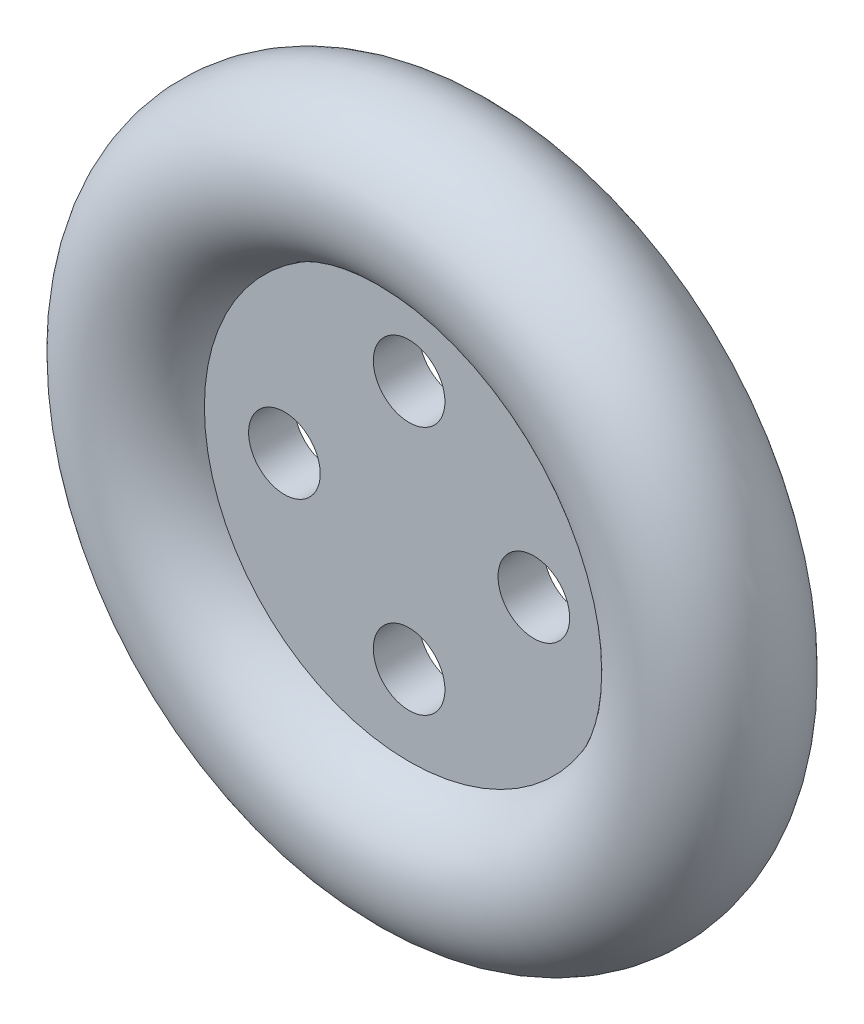
ISO-10303-21;
HEADER;
FILE_DESCRIPTION(('STEP AP214'),'2;1');
FILE_NAME('part.step','',(''),(''),'','','');
FILE_SCHEMA(('AUTOMOTIVE_DESIGN { 1 0 10303 214 1 1 1 1 }'));
ENDSEC;
DATA;
#1=APPLICATION_CONTEXT('core data for automotive mechanical design processes');
#2=APPLICATION_PROTOCOL_DEFINITION('international standard','automotive_design',2000,#1);
#3=PRODUCT_CONTEXT('',#1,'mechanical');
#4=PRODUCT('Part','Part','',(#3));
#5=PRODUCT_RELATED_PRODUCT_CATEGORY('part','',(#4));
#6=PRODUCT_DEFINITION_FORMATION('','',#4);
#7=PRODUCT_DEFINITION_CONTEXT('part definition',#1,'design');
#8=PRODUCT_DEFINITION('design','',#6,#7);
#9=PRODUCT_DEFINITION_SHAPE('','',#8);
#10=(LENGTH_UNIT() NAMED_UNIT(*) SI_UNIT(.MILLI.,.METRE.));
#11=(NAMED_UNIT(*) PLANE_ANGLE_UNIT() SI_UNIT($,.RADIAN.));
#12=(NAMED_UNIT(*) SI_UNIT($,.STERADIAN.) SOLID_ANGLE_UNIT());
#13=UNCERTAINTY_MEASURE_WITH_UNIT(LENGTH_MEASURE(1.E-05),#10,'distance_accuracy_value','');
#14=(GEOMETRIC_REPRESENTATION_CONTEXT(3) GLOBAL_UNCERTAINTY_ASSIGNED_CONTEXT((#13)) GLOBAL_UNIT_ASSIGNED_CONTEXT((#10,
#11,#12)) REPRESENTATION_CONTEXT('',''));
#15=CARTESIAN_POINT('',(0.,0.,0.));
#16=DIRECTION('',(0.,0.,1.));
#17=DIRECTION('',(1.,0.,0.));
#18=AXIS2_PLACEMENT_3D('',#15,#16,#17);
#19=CARTESIAN_POINT('',(0.,0.,5.));
#20=DIRECTION('',(0.,0.,-1.));
#21=DIRECTION('',(-1.,0.,0.));
#22=AXIS2_PLACEMENT_3D('',#19,#20,#21);
#23=TOROIDAL_SURFACE('',#22,60.5025004861397,16.6313248127819);
#24=CARTESIAN_POINT('',(0.,0.,10.));
#25=DIRECTION('',(0.,0.,-1.));
#26=DIRECTION('',(-1.,0.,0.));
#27=AXIS2_PLACEMENT_3D('',#24,#25,#26);
#28=CIRCLE('',#27,44.640566019365);
#29=CARTESIAN_POINT('',(-44.640566019365,0.,10.));
#30=VERTEX_POINT('',#29);
#31=EDGE_CURVE('E10',#30,#30,#28,.T.);
#32=ORIENTED_EDGE('',*,*,#31,.T.);
#33=EDGE_LOOP('',(#32));
#34=FACE_BOUND('',#33,.T.);
#35=CARTESIAN_POINT('',(0.,0.,0.));
#36=DIRECTION('',(0.,0.,-1.));
#37=DIRECTION('',(-1.,0.,0.));
#38=AXIS2_PLACEMENT_3D('',#35,#36,#37);
#39=CIRCLE('',#38,44.640566019365);
#40=CARTESIAN_POINT('',(-44.640566019365,0.,0.));
#41=VERTEX_POINT('',#40);
#42=EDGE_CURVE('E60',#41,#41,#39,.T.);
#43=ORIENTED_EDGE('',*,*,#42,.F.);
#44=EDGE_LOOP('',(#43));
#45=FACE_BOUND('',#44,.T.);
#46=ADVANCED_FACE('F36',(#34,#45),#23,.T.);
#47=CARTESIAN_POINT('',(0.,0.,0.));
#48=DIRECTION('',(0.,0.,1.));
#49=DIRECTION('',(1.,0.,0.));
#50=AXIS2_PLACEMENT_3D('',#47,#48,#49);
#51=PLANE('',#50);
#52=CARTESIAN_POINT('',(0.,27.1892698271459,0.));
#53=DIRECTION('',(0.,0.,1.));
#54=DIRECTION('',(1.,0.,0.));
#55=AXIS2_PLACEMENT_3D('',#52,#53,#54);
#56=CIRCLE('',#55,7.80908870427028);
#57=CARTESIAN_POINT('',(7.80908870427028,27.1892698271459,0.));
#58=VERTEX_POINT('',#57);
#59=EDGE_CURVE('E68',#58,#58,#56,.T.);
#60=ORIENTED_EDGE('',*,*,#59,.T.);
#61=EDGE_LOOP('',(#60));
#62=FACE_BOUND('',#61,.T.);
#63=CARTESIAN_POINT('',(27.1892698271466,7.67770938812246E-13,0.));
#64=DIRECTION('',(0.,0.,1.));
#65=DIRECTION('',(1.,0.,0.));
#66=AXIS2_PLACEMENT_3D('',#63,#64,#65);
#67=CIRCLE('',#66,7.80908870427089);
#68=CARTESIAN_POINT('',(34.9983585314175,7.67770938812246E-13,0.));
#69=VERTEX_POINT('',#68);
#70=EDGE_CURVE('E137',#69,#69,#67,.T.);
#71=ORIENTED_EDGE('',*,*,#70,.T.);
#72=EDGE_LOOP('',(#71));
#73=FACE_BOUND('',#72,.T.);
#74=CARTESIAN_POINT('',(1.53554187762449E-12,-27.1892698271459,0.));
#75=DIRECTION('',(0.,0.,1.));
#76=DIRECTION('',(1.,0.,0.));
#77=AXIS2_PLACEMENT_3D('',#74,#75,#76);
#78=CIRCLE('',#77,7.80908870427193);
#79=CARTESIAN_POINT('',(7.80908870427347,-27.1892698271459,0.));
#80=VERTEX_POINT('',#79);
#81=EDGE_CURVE('E140',#80,#80,#78,.T.);
#82=ORIENTED_EDGE('',*,*,#81,.T.);
#83=EDGE_LOOP('',(#82));
#84=FACE_BOUND('',#83,.T.);
#85=CARTESIAN_POINT('',(-27.1892698271451,-7.71100664038742E-13,0.));
#86=DIRECTION('',(0.,0.,1.));
#87=DIRECTION('',(1.,0.,0.));
#88=AXIS2_PLACEMENT_3D('',#85,#86,#87);
#89=CIRCLE('',#88,7.80908870427152);
#90=CARTESIAN_POINT('',(-19.3801811228736,-7.71100664038742E-13,0.));
#91=VERTEX_POINT('',#90);
#92=EDGE_CURVE('E144',#91,#91,#89,.T.);
#93=ORIENTED_EDGE('',*,*,#92,.T.);
#94=EDGE_LOOP('',(#93));
#95=FACE_BOUND('',#94,.T.);
#96=ORIENTED_EDGE('',*,*,#42,.T.);
#97=EDGE_LOOP('',(#96));
#98=FACE_BOUND('',#97,.T.);
#99=ADVANCED_FACE('F93',(#62,#73,#84,#95,#98),#51,.F.);
#100=CARTESIAN_POINT('',(0.,0.,10.));
#101=DIRECTION('',(0.,0.,1.));
#102=DIRECTION('',(1.,0.,0.));
#103=AXIS2_PLACEMENT_3D('',#100,#101,#102);
#104=PLANE('',#103);
#105=CARTESIAN_POINT('',(0.,27.1892698271459,10.));
#106=DIRECTION('',(0.,0.,1.));
#107=DIRECTION('',(1.,0.,0.));
#108=AXIS2_PLACEMENT_3D('',#105,#106,#107);
#109=CIRCLE('',#108,7.80908870427028);
#110=CARTESIAN_POINT('',(7.80908870427028,27.1892698271459,10.));
#111=VERTEX_POINT('',#110);
#112=EDGE_CURVE('E40',#111,#111,#109,.F.);
#113=ORIENTED_EDGE('',*,*,#112,.T.);
#114=EDGE_LOOP('',(#113));
#115=FACE_BOUND('',#114,.T.);
#116=CARTESIAN_POINT('',(27.1892698271466,7.67770938812246E-13,10.));
#117=DIRECTION('',(0.,0.,1.));
#118=DIRECTION('',(1.,0.,0.));
#119=AXIS2_PLACEMENT_3D('',#116,#117,#118);
#120=CIRCLE('',#119,7.80908870427089);
#121=CARTESIAN_POINT('',(34.9983585314175,7.67770938812246E-13,10.));
#122=VERTEX_POINT('',#121);
#123=EDGE_CURVE('E70',#122,#122,#120,.F.);
#124=ORIENTED_EDGE('',*,*,#123,.T.);
#125=EDGE_LOOP('',(#124));
#126=FACE_BOUND('',#125,.T.);
#127=CARTESIAN_POINT('',(1.53554187762449E-12,-27.1892698271459,10.));
#128=DIRECTION('',(0.,0.,1.));
#129=DIRECTION('',(1.,0.,0.));
#130=AXIS2_PLACEMENT_3D('',#127,#128,#129);
#131=CIRCLE('',#130,7.80908870427193);
#132=CARTESIAN_POINT('',(7.80908870427347,-27.1892698271459,10.));
#133=VERTEX_POINT('',#132);
#134=EDGE_CURVE('E67',#133,#133,#131,.F.);
#135=ORIENTED_EDGE('',*,*,#134,.T.);
#136=EDGE_LOOP('',(#135));
#137=FACE_BOUND('',#136,.T.);
#138=CARTESIAN_POINT('',(-27.1892698271451,-7.71100664038742E-13,10.));
#139=DIRECTION('',(0.,0.,1.));
#140=DIRECTION('',(1.,0.,0.));
#141=AXIS2_PLACEMENT_3D('',#138,#139,#140);
#142=CIRCLE('',#141,7.80908870427152);
#143=CARTESIAN_POINT('',(-19.3801811228736,-7.71100664038742E-13,10.));
#144=VERTEX_POINT('',#143);
#145=EDGE_CURVE('E64',#144,#144,#142,.F.);
#146=ORIENTED_EDGE('',*,*,#145,.T.);
#147=EDGE_LOOP('',(#146));
#148=FACE_BOUND('',#147,.T.);
#149=ORIENTED_EDGE('',*,*,#31,.F.);
#150=EDGE_LOOP('',(#149));
#151=FACE_BOUND('',#150,.T.);
#152=ADVANCED_FACE('F103',(#115,#126,#137,#148,#151),#104,.T.);
#153=CARTESIAN_POINT('',(-27.1892698271451,-7.71100664038742E-13,49.));
#154=DIRECTION('',(0.,0.,-1.));
#155=DIRECTION('',(-1.,0.,0.));
#156=AXIS2_PLACEMENT_3D('',#153,#154,#155);
#157=CYLINDRICAL_SURFACE('',#156,7.80908870427152);
#158=ORIENTED_EDGE('',*,*,#145,.F.);
#159=EDGE_LOOP('',(#158));
#160=FACE_BOUND('',#159,.T.);
#161=ORIENTED_EDGE('',*,*,#92,.F.);
#162=EDGE_LOOP('',(#161));
#163=FACE_BOUND('',#162,.T.);
#164=ADVANCED_FACE('F109',(#160,#163),#157,.F.);
#165=CARTESIAN_POINT('',(1.53554187762449E-12,-27.1892698271459,49.));
#166=DIRECTION('',(0.,0.,-1.));
#167=DIRECTION('',(-1.,0.,0.));
#168=AXIS2_PLACEMENT_3D('',#165,#166,#167);
#169=CYLINDRICAL_SURFACE('',#168,7.80908870427193);
#170=ORIENTED_EDGE('',*,*,#134,.F.);
#171=EDGE_LOOP('',(#170));
#172=FACE_BOUND('',#171,.T.);
#173=ORIENTED_EDGE('',*,*,#81,.F.);
#174=EDGE_LOOP('',(#173));
#175=FACE_BOUND('',#174,.T.);
#176=ADVANCED_FACE('F114',(#172,#175),#169,.F.);
#177=CARTESIAN_POINT('',(27.1892698271466,7.67770938812246E-13,49.));
#178=DIRECTION('',(0.,0.,-1.));
#179=DIRECTION('',(-1.,0.,0.));
#180=AXIS2_PLACEMENT_3D('',#177,#178,#179);
#181=CYLINDRICAL_SURFACE('',#180,7.80908870427089);
#182=ORIENTED_EDGE('',*,*,#123,.F.);
#183=EDGE_LOOP('',(#182));
#184=FACE_BOUND('',#183,.T.);
#185=ORIENTED_EDGE('',*,*,#70,.F.);
#186=EDGE_LOOP('',(#185));
#187=FACE_BOUND('',#186,.T.);
#188=ADVANCED_FACE('F125',(#184,#187),#181,.F.);
#189=CARTESIAN_POINT('',(0.,27.1892698271459,49.));
#190=DIRECTION('',(0.,0.,-1.));
#191=DIRECTION('',(-1.,0.,0.));
#192=AXIS2_PLACEMENT_3D('',#189,#190,#191);
#193=CYLINDRICAL_SURFACE('',#192,7.80908870427028);
#194=ORIENTED_EDGE('',*,*,#112,.F.);
#195=EDGE_LOOP('',(#194));
#196=FACE_BOUND('',#195,.T.);
#197=ORIENTED_EDGE('',*,*,#59,.F.);
#198=EDGE_LOOP('',(#197));
#199=FACE_BOUND('',#198,.T.);
#200=ADVANCED_FACE('F129',(#196,#199),#193,.F.);
#201=CLOSED_SHELL('',(#46,#99,#152,#164,#176,#188,#200));
#202=CARTESIAN_POINT('',(0.,0.,10.));
#203=DIRECTION('',(0.,0.,-1.));
#204=DIRECTION('',(-1.,0.,0.));
#205=AXIS2_PLACEMENT_3D('',#202,#203,#204);
#206=CYLINDRICAL_SURFACE('',#205,60.5025004861397);
#207=CARTESIAN_POINT('',(0.,0.,10.));
#208=DIRECTION('',(0.,0.,1.));
#209=DIRECTION('',(1.,0.,0.));
#210=AXIS2_PLACEMENT_3D('',#207,#208,#209);
#211=CIRCLE('',#210,60.5025004861397);
#212=CARTESIAN_POINT('',(60.5025004861397,0.,10.));
#213=VERTEX_POINT('',#212);
#214=EDGE_CURVE('E50',#213,#213,#211,.T.);
#215=ORIENTED_EDGE('',*,*,#214,.F.);
#216=EDGE_LOOP('',(#215));
#217=FACE_BOUND('',#216,.T.);
#218=CARTESIAN_POINT('',(0.,0.,0.));
#219=DIRECTION('',(0.,0.,1.));
#220=DIRECTION('',(1.,0.,0.));
#221=AXIS2_PLACEMENT_3D('',#218,#219,#220);
#222=CIRCLE('',#221,60.5025004861397);
#223=CARTESIAN_POINT('',(60.5025004861397,0.,0.));
#224=VERTEX_POINT('',#223);
#225=EDGE_CURVE('E58',#224,#224,#222,.T.);
#226=ORIENTED_EDGE('',*,*,#225,.T.);
#227=EDGE_LOOP('',(#226));
#228=FACE_BOUND('',#227,.T.);
#229=ADVANCED_FACE('F38',(#217,#228),#206,.T.);
#230=CARTESIAN_POINT('',(0.,0.,10.));
#231=DIRECTION('',(0.,0.,-1.));
#232=DIRECTION('',(-1.,0.,0.));
#233=AXIS2_PLACEMENT_3D('',#230,#231,#232);
#234=CIRCLE('',#233,56.1465311597306);
#235=CARTESIAN_POINT('',(-56.1465311597306,0.,10.));
#236=VERTEX_POINT('',#235);
#237=EDGE_CURVE('E54',#236,#236,#234,.T.);
#238=ORIENTED_EDGE('',*,*,#237,.T.);
#239=EDGE_LOOP('',(#238));
#240=FACE_BOUND('',#239,.T.);
#241=ORIENTED_EDGE('',*,*,#214,.T.);
#242=EDGE_LOOP('',(#241));
#243=FACE_BOUND('',#242,.T.);
#244=ADVANCED_FACE('F80',(#240,#243),#104,.T.);
#245=CARTESIAN_POINT('',(0.,0.,0.));
#246=DIRECTION('',(0.,0.,-1.));
#247=DIRECTION('',(-1.,0.,0.));
#248=AXIS2_PLACEMENT_3D('',#245,#246,#247);
#249=CIRCLE('',#248,56.1465311597306);
#250=CARTESIAN_POINT('',(-56.1465311597306,0.,0.));
#251=VERTEX_POINT('',#250);
#252=EDGE_CURVE('E45',#251,#251,#249,.T.);
#253=ORIENTED_EDGE('',*,*,#252,.F.);
#254=EDGE_LOOP('',(#253));
#255=FACE_BOUND('',#254,.T.);
#256=ORIENTED_EDGE('',*,*,#225,.F.);
#257=EDGE_LOOP('',(#256));
#258=FACE_BOUND('',#257,.T.);
#259=ADVANCED_FACE('F86',(#255,#258),#51,.F.);
#260=CARTESIAN_POINT('',(0.,0.,5.));
#261=DIRECTION('',(0.,0.,-1.));
#262=DIRECTION('',(-1.,0.,0.));
#263=AXIS2_PLACEMENT_3D('',#260,#261,#262);
#264=TOROIDAL_SURFACE('',#263,60.5025004861397,6.63132481278192);
#265=ORIENTED_EDGE('',*,*,#237,.F.);
#266=EDGE_LOOP('',(#265));
#267=FACE_BOUND('',#266,.T.);
#268=ORIENTED_EDGE('',*,*,#252,.T.);
#269=EDGE_LOOP('',(#268));
#270=FACE_BOUND('',#269,.T.);
#271=ADVANCED_FACE('F83',(#267,#270),#264,.F.);
#272=CLOSED_SHELL('',(#229,#244,#259,#271));
#273=ORIENTED_CLOSED_SHELL('',*,#272,.T.);
#274=BREP_WITH_VOIDS('B2',#201,(#273));
#275=ADVANCED_BREP_SHAPE_REPRESENTATION('',(#18,#274),#14);
#276=SHAPE_DEFINITION_REPRESENTATION(#9,#275);
ENDSEC;
END-ISO-10303-21;
